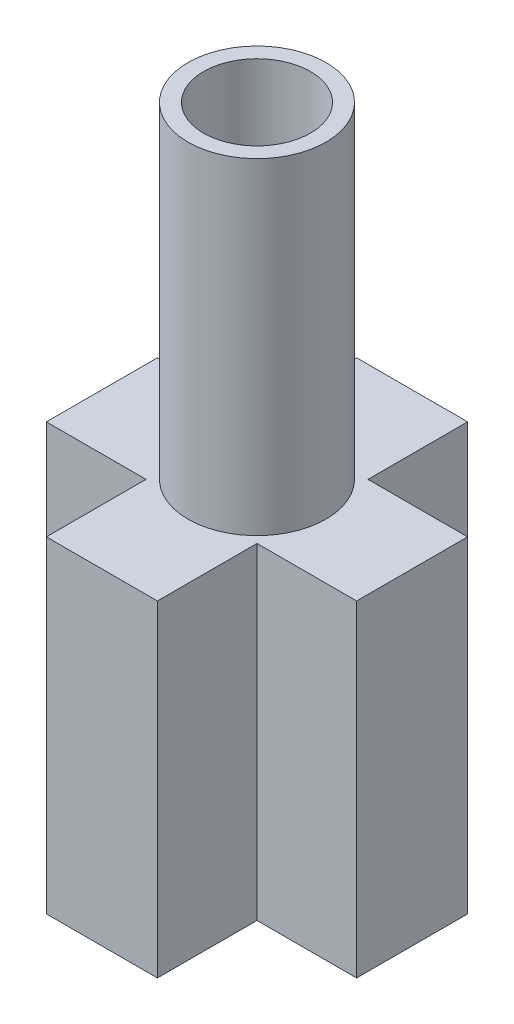
ISO-10303-21;
HEADER;
FILE_DESCRIPTION(('STEP AP214'),'2;1');
FILE_NAME('part.step','',(''),(''),'','','');
FILE_SCHEMA(('AUTOMOTIVE_DESIGN { 1 0 10303 214 1 1 1 1 }'));
ENDSEC;
DATA;
#1=APPLICATION_CONTEXT('core data for automotive mechanical design processes');
#2=APPLICATION_PROTOCOL_DEFINITION('international standard','automotive_design',2000,#1);
#3=PRODUCT_CONTEXT('',#1,'mechanical');
#4=PRODUCT('Part','Part','',(#3));
#5=PRODUCT_RELATED_PRODUCT_CATEGORY('part','',(#4));
#6=PRODUCT_DEFINITION_FORMATION('','',#4);
#7=PRODUCT_DEFINITION_CONTEXT('part definition',#1,'design');
#8=PRODUCT_DEFINITION('design','',#6,#7);
#9=PRODUCT_DEFINITION_SHAPE('','',#8);
#10=(LENGTH_UNIT() NAMED_UNIT(*) SI_UNIT(.MILLI.,.METRE.));
#11=(NAMED_UNIT(*) PLANE_ANGLE_UNIT() SI_UNIT($,.RADIAN.));
#12=(NAMED_UNIT(*) SI_UNIT($,.STERADIAN.) SOLID_ANGLE_UNIT());
#13=UNCERTAINTY_MEASURE_WITH_UNIT(LENGTH_MEASURE(1.E-05),#10,'distance_accuracy_value','');
#14=(GEOMETRIC_REPRESENTATION_CONTEXT(3) GLOBAL_UNCERTAINTY_ASSIGNED_CONTEXT((#13)) GLOBAL_UNIT_ASSIGNED_CONTEXT((#10,
#11,#12)) REPRESENTATION_CONTEXT('',''));
#15=CARTESIAN_POINT('',(0.,0.,0.));
#16=DIRECTION('',(0.,0.,1.));
#17=DIRECTION('',(1.,0.,0.));
#18=AXIS2_PLACEMENT_3D('',#15,#16,#17);
#19=CARTESIAN_POINT('',(0.863599999999994,5.08,0.863599999999999));
#20=DIRECTION('',(-1.,0.,0.));
#21=DIRECTION('',(0.,0.,1.));
#22=AXIS2_PLACEMENT_3D('',#19,#20,#21);
#23=PLANE('',#22);
#24=DIRECTION('',(0.,0.,-1.));
#25=VECTOR('',#24,1.);
#26=CARTESIAN_POINT('',(0.863599999999994,0.,0.863599999999999));
#27=LINE('',#26,#25);
#28=CARTESIAN_POINT('',(0.863599999999985,0.,2.41299999999999));
#29=VERTEX_POINT('',#28);
#30=CARTESIAN_POINT('',(0.863599999999994,0.,0.863599999999999));
#31=VERTEX_POINT('',#30);
#32=EDGE_CURVE('E161',#29,#31,#27,.T.);
#33=ORIENTED_EDGE('',*,*,#32,.T.);
#34=DIRECTION('',(0.,-1.,0.));
#35=VECTOR('',#34,1.);
#36=CARTESIAN_POINT('',(0.863599999999994,5.08,0.863599999999999));
#37=LINE('',#36,#35);
#38=CARTESIAN_POINT('',(0.863599999999994,5.08,0.863599999999999));
#39=VERTEX_POINT('',#38);
#40=EDGE_CURVE('E11',#39,#31,#37,.T.);
#41=ORIENTED_EDGE('',*,*,#40,.F.);
#42=DIRECTION('',(0.,0.,-1.));
#43=VECTOR('',#42,1.);
#44=CARTESIAN_POINT('',(0.863599999999994,5.08,0.863599999999999));
#45=LINE('',#44,#43);
#46=CARTESIAN_POINT('',(0.863599999999985,5.08,2.41299999999999));
#47=VERTEX_POINT('',#46);
#48=EDGE_CURVE('E184',#47,#39,#45,.T.);
#49=ORIENTED_EDGE('',*,*,#48,.F.);
#50=DIRECTION('',(0.,-1.,0.));
#51=VECTOR('',#50,1.);
#52=CARTESIAN_POINT('',(0.863599999999985,5.08,2.41299999999999));
#53=LINE('',#52,#51);
#54=EDGE_CURVE('E157',#47,#29,#53,.T.);
#55=ORIENTED_EDGE('',*,*,#54,.T.);
#56=EDGE_LOOP('',(#33,#41,#49,#55));
#57=FACE_BOUND('',#56,.T.);
#58=ADVANCED_FACE('F41',(#57),#23,.F.);
#59=CARTESIAN_POINT('',(0.863599999999994,5.08,0.863599999999999));
#60=DIRECTION('',(0.,0.,-1.));
#61=DIRECTION('',(-1.,0.,0.));
#62=AXIS2_PLACEMENT_3D('',#59,#60,#61);
#63=PLANE('',#62);
#64=DIRECTION('',(1.,0.,0.));
#65=VECTOR('',#64,1.);
#66=CARTESIAN_POINT('',(0.863599999999994,0.,0.863599999999999));
#67=LINE('',#66,#65);
#68=CARTESIAN_POINT('',(2.41299999999999,0.,0.863599999999998));
#69=VERTEX_POINT('',#68);
#70=EDGE_CURVE('E164',#31,#69,#67,.T.);
#71=ORIENTED_EDGE('',*,*,#70,.T.);
#72=DIRECTION('',(0.,-1.,0.));
#73=VECTOR('',#72,1.);
#74=CARTESIAN_POINT('',(2.41299999999999,5.08,0.863599999999998));
#75=LINE('',#74,#73);
#76=CARTESIAN_POINT('',(2.41299999999999,5.08,0.863599999999998));
#77=VERTEX_POINT('',#76);
#78=EDGE_CURVE('E49',#77,#69,#75,.T.);
#79=ORIENTED_EDGE('',*,*,#78,.F.);
#80=DIRECTION('',(1.,0.,0.));
#81=VECTOR('',#80,1.);
#82=CARTESIAN_POINT('',(0.863599999999994,5.08,0.863599999999999));
#83=LINE('',#82,#81);
#84=EDGE_CURVE('E112',#39,#77,#83,.T.);
#85=ORIENTED_EDGE('',*,*,#84,.F.);
#86=ORIENTED_EDGE('',*,*,#40,.T.);
#87=EDGE_LOOP('',(#71,#79,#85,#86));
#88=FACE_BOUND('',#87,.T.);
#89=ADVANCED_FACE('F263',(#88),#63,.F.);
#90=CARTESIAN_POINT('',(2.41299999999999,5.08,0.863599999999998));
#91=DIRECTION('',(-1.,0.,0.));
#92=DIRECTION('',(0.,0.,1.));
#93=AXIS2_PLACEMENT_3D('',#90,#91,#92);
#94=PLANE('',#93);
#95=DIRECTION('',(0.,0.,-1.));
#96=VECTOR('',#95,1.);
#97=CARTESIAN_POINT('',(2.41299999999999,0.,0.863599999999998));
#98=LINE('',#97,#96);
#99=CARTESIAN_POINT('',(2.41299999999999,0.,-0.863600000000002));
#100=VERTEX_POINT('',#99);
#101=EDGE_CURVE('E167',#69,#100,#98,.T.);
#102=ORIENTED_EDGE('',*,*,#101,.T.);
#103=DIRECTION('',(0.,-1.,0.));
#104=VECTOR('',#103,1.);
#105=CARTESIAN_POINT('',(2.41299999999999,5.08,-0.863600000000002));
#106=LINE('',#105,#104);
#107=CARTESIAN_POINT('',(2.41299999999999,5.08,-0.863600000000002));
#108=VERTEX_POINT('',#107);
#109=EDGE_CURVE('E203',#108,#100,#106,.T.);
#110=ORIENTED_EDGE('',*,*,#109,.F.);
#111=DIRECTION('',(0.,0.,-1.));
#112=VECTOR('',#111,1.);
#113=CARTESIAN_POINT('',(2.41299999999999,5.08,0.863599999999998));
#114=LINE('',#113,#112);
#115=EDGE_CURVE('E211',#77,#108,#114,.T.);
#116=ORIENTED_EDGE('',*,*,#115,.F.);
#117=ORIENTED_EDGE('',*,*,#78,.T.);
#118=EDGE_LOOP('',(#102,#110,#116,#117));
#119=FACE_BOUND('',#118,.T.);
#120=ADVANCED_FACE('F209',(#119),#94,.F.);
#121=CARTESIAN_POINT('',(0.863599999999994,5.08,-0.863600000000001));
#122=DIRECTION('',(0.,0.,1.));
#123=DIRECTION('',(1.,0.,0.));
#124=AXIS2_PLACEMENT_3D('',#121,#122,#123);
#125=PLANE('',#124);
#126=DIRECTION('',(-1.,0.,0.));
#127=VECTOR('',#126,1.);
#128=CARTESIAN_POINT('',(0.863599999999994,0.,-0.863600000000001));
#129=LINE('',#128,#127);
#130=CARTESIAN_POINT('',(0.863599999999994,0.,-0.863600000000001));
#131=VERTEX_POINT('',#130);
#132=EDGE_CURVE('E169',#100,#131,#129,.T.);
#133=ORIENTED_EDGE('',*,*,#132,.T.);
#134=DIRECTION('',(0.,-1.,0.));
#135=VECTOR('',#134,1.);
#136=CARTESIAN_POINT('',(0.863599999999994,5.08,-0.863600000000001));
#137=LINE('',#136,#135);
#138=CARTESIAN_POINT('',(0.863599999999994,5.08,-0.863600000000001));
#139=VERTEX_POINT('',#138);
#140=EDGE_CURVE('E200',#139,#131,#137,.T.);
#141=ORIENTED_EDGE('',*,*,#140,.F.);
#142=DIRECTION('',(-1.,0.,0.));
#143=VECTOR('',#142,1.);
#144=CARTESIAN_POINT('',(0.863599999999994,5.08,-0.863600000000001));
#145=LINE('',#144,#143);
#146=EDGE_CURVE('E229',#108,#139,#145,.T.);
#147=ORIENTED_EDGE('',*,*,#146,.F.);
#148=ORIENTED_EDGE('',*,*,#109,.T.);
#149=EDGE_LOOP('',(#133,#141,#147,#148));
#150=FACE_BOUND('',#149,.T.);
#151=ADVANCED_FACE('F220',(#150),#125,.F.);
#152=CARTESIAN_POINT('',(0.863599999999985,5.08,-2.413));
#153=DIRECTION('',(-1.,0.,0.));
#154=DIRECTION('',(0.,0.,1.));
#155=AXIS2_PLACEMENT_3D('',#152,#153,#154);
#156=PLANE('',#155);
#157=DIRECTION('',(0.,0.,-1.));
#158=VECTOR('',#157,1.);
#159=CARTESIAN_POINT('',(0.863599999999985,0.,-2.413));
#160=LINE('',#159,#158);
#161=CARTESIAN_POINT('',(0.863599999999985,0.,-2.413));
#162=VERTEX_POINT('',#161);
#163=EDGE_CURVE('E171',#131,#162,#160,.T.);
#164=ORIENTED_EDGE('',*,*,#163,.T.);
#165=DIRECTION('',(0.,-1.,0.));
#166=VECTOR('',#165,1.);
#167=CARTESIAN_POINT('',(0.863599999999985,5.08,-2.413));
#168=LINE('',#167,#166);
#169=CARTESIAN_POINT('',(0.863599999999985,5.08,-2.413));
#170=VERTEX_POINT('',#169);
#171=EDGE_CURVE('E197',#170,#162,#168,.T.);
#172=ORIENTED_EDGE('',*,*,#171,.F.);
#173=DIRECTION('',(0.,0.,-1.));
#174=VECTOR('',#173,1.);
#175=CARTESIAN_POINT('',(0.863599999999985,5.08,-2.413));
#176=LINE('',#175,#174);
#177=EDGE_CURVE('E226',#139,#170,#176,.T.);
#178=ORIENTED_EDGE('',*,*,#177,.F.);
#179=ORIENTED_EDGE('',*,*,#140,.T.);
#180=EDGE_LOOP('',(#164,#172,#178,#179));
#181=FACE_BOUND('',#180,.T.);
#182=ADVANCED_FACE('F224',(#181),#156,.F.);
#183=CARTESIAN_POINT('',(-0.863600000000019,5.08,-2.413));
#184=DIRECTION('',(0.,0.,1.));
#185=DIRECTION('',(1.,0.,0.));
#186=AXIS2_PLACEMENT_3D('',#183,#184,#185);
#187=PLANE('',#186);
#188=DIRECTION('',(-1.,0.,0.));
#189=VECTOR('',#188,1.);
#190=CARTESIAN_POINT('',(-0.863600000000019,0.,-2.413));
#191=LINE('',#190,#189);
#192=CARTESIAN_POINT('',(-0.863600000000019,0.,-2.413));
#193=VERTEX_POINT('',#192);
#194=EDGE_CURVE('E173',#162,#193,#191,.T.);
#195=ORIENTED_EDGE('',*,*,#194,.T.);
#196=DIRECTION('',(0.,-1.,0.));
#197=VECTOR('',#196,1.);
#198=CARTESIAN_POINT('',(-0.863600000000019,5.08,-2.413));
#199=LINE('',#198,#197);
#200=CARTESIAN_POINT('',(-0.863600000000019,5.08,-2.413));
#201=VERTEX_POINT('',#200);
#202=EDGE_CURVE('E194',#201,#193,#199,.T.);
#203=ORIENTED_EDGE('',*,*,#202,.F.);
#204=DIRECTION('',(-1.,0.,0.));
#205=VECTOR('',#204,1.);
#206=CARTESIAN_POINT('',(-0.863600000000019,5.08,-2.413));
#207=LINE('',#206,#205);
#208=EDGE_CURVE('E228',#170,#201,#207,.T.);
#209=ORIENTED_EDGE('',*,*,#208,.F.);
#210=ORIENTED_EDGE('',*,*,#171,.T.);
#211=EDGE_LOOP('',(#195,#203,#209,#210));
#212=FACE_BOUND('',#211,.T.);
#213=ADVANCED_FACE('F276',(#212),#187,.F.);
#214=CARTESIAN_POINT('',(-0.863600000000019,5.08,-2.413));
#215=DIRECTION('',(1.,0.,0.));
#216=DIRECTION('',(0.,0.,-1.));
#217=AXIS2_PLACEMENT_3D('',#214,#215,#216);
#218=PLANE('',#217);
#219=DIRECTION('',(0.,0.,1.));
#220=VECTOR('',#219,1.);
#221=CARTESIAN_POINT('',(-0.863600000000019,0.,-2.413));
#222=LINE('',#221,#220);
#223=CARTESIAN_POINT('',(-0.863600000000004,0.,-0.8636));
#224=VERTEX_POINT('',#223);
#225=EDGE_CURVE('E175',#193,#224,#222,.T.);
#226=ORIENTED_EDGE('',*,*,#225,.T.);
#227=DIRECTION('',(0.,-1.,0.));
#228=VECTOR('',#227,1.);
#229=CARTESIAN_POINT('',(-0.863600000000004,5.08,-0.8636));
#230=LINE('',#229,#228);
#231=CARTESIAN_POINT('',(-0.863600000000004,5.08,-0.8636));
#232=VERTEX_POINT('',#231);
#233=EDGE_CURVE('E191',#232,#224,#230,.T.);
#234=ORIENTED_EDGE('',*,*,#233,.F.);
#235=DIRECTION('',(0.,0.,1.));
#236=VECTOR('',#235,1.);
#237=CARTESIAN_POINT('',(-0.863600000000019,5.08,-2.413));
#238=LINE('',#237,#236);
#239=EDGE_CURVE('E231',#201,#232,#238,.T.);
#240=ORIENTED_EDGE('',*,*,#239,.F.);
#241=ORIENTED_EDGE('',*,*,#202,.T.);
#242=EDGE_LOOP('',(#226,#234,#240,#241));
#243=FACE_BOUND('',#242,.T.);
#244=ADVANCED_FACE('F279',(#243),#218,.F.);
#245=CARTESIAN_POINT('',(-2.41300000000001,5.08,-0.863600000000002));
#246=DIRECTION('',(0.,0.,1.));
#247=DIRECTION('',(1.,0.,0.));
#248=AXIS2_PLACEMENT_3D('',#245,#246,#247);
#249=PLANE('',#248);
#250=DIRECTION('',(-1.,0.,0.));
#251=VECTOR('',#250,1.);
#252=CARTESIAN_POINT('',(-2.41300000000001,0.,-0.863600000000002));
#253=LINE('',#252,#251);
#254=CARTESIAN_POINT('',(-2.41300000000001,0.,-0.863600000000002));
#255=VERTEX_POINT('',#254);
#256=EDGE_CURVE('E177',#224,#255,#253,.T.);
#257=ORIENTED_EDGE('',*,*,#256,.T.);
#258=DIRECTION('',(0.,-1.,0.));
#259=VECTOR('',#258,1.);
#260=CARTESIAN_POINT('',(-2.41300000000001,5.08,-0.863600000000002));
#261=LINE('',#260,#259);
#262=CARTESIAN_POINT('',(-2.41300000000001,5.08,-0.863600000000002));
#263=VERTEX_POINT('',#262);
#264=EDGE_CURVE('E188',#263,#255,#261,.T.);
#265=ORIENTED_EDGE('',*,*,#264,.F.);
#266=DIRECTION('',(-1.,0.,0.));
#267=VECTOR('',#266,1.);
#268=CARTESIAN_POINT('',(-2.41300000000001,5.08,-0.863600000000002));
#269=LINE('',#268,#267);
#270=EDGE_CURVE('E237',#232,#263,#269,.T.);
#271=ORIENTED_EDGE('',*,*,#270,.F.);
#272=ORIENTED_EDGE('',*,*,#233,.T.);
#273=EDGE_LOOP('',(#257,#265,#271,#272));
#274=FACE_BOUND('',#273,.T.);
#275=ADVANCED_FACE('F243',(#274),#249,.F.);
#276=CARTESIAN_POINT('',(-2.41300000000001,5.08,0.863599999999998));
#277=DIRECTION('',(1.,0.,0.));
#278=DIRECTION('',(0.,0.,-1.));
#279=AXIS2_PLACEMENT_3D('',#276,#277,#278);
#280=PLANE('',#279);
#281=DIRECTION('',(0.,0.,1.));
#282=VECTOR('',#281,1.);
#283=CARTESIAN_POINT('',(-2.41300000000001,0.,0.863599999999998));
#284=LINE('',#283,#282);
#285=CARTESIAN_POINT('',(-2.41300000000001,0.,0.863599999999998));
#286=VERTEX_POINT('',#285);
#287=EDGE_CURVE('E179',#255,#286,#284,.T.);
#288=ORIENTED_EDGE('',*,*,#287,.T.);
#289=DIRECTION('',(0.,-1.,0.));
#290=VECTOR('',#289,1.);
#291=CARTESIAN_POINT('',(-2.41300000000001,5.08,0.863599999999998));
#292=LINE('',#291,#290);
#293=CARTESIAN_POINT('',(-2.41300000000001,5.08,0.863599999999998));
#294=VERTEX_POINT('',#293);
#295=EDGE_CURVE('E152',#294,#286,#292,.T.);
#296=ORIENTED_EDGE('',*,*,#295,.F.);
#297=DIRECTION('',(0.,0.,1.));
#298=VECTOR('',#297,1.);
#299=CARTESIAN_POINT('',(-2.41300000000001,5.08,0.863599999999998));
#300=LINE('',#299,#298);
#301=EDGE_CURVE('E143',#263,#294,#300,.T.);
#302=ORIENTED_EDGE('',*,*,#301,.F.);
#303=ORIENTED_EDGE('',*,*,#264,.T.);
#304=EDGE_LOOP('',(#288,#296,#302,#303));
#305=FACE_BOUND('',#304,.T.);
#306=ADVANCED_FACE('F247',(#305),#280,.F.);
#307=CARTESIAN_POINT('',(-2.41300000000001,5.08,0.863599999999998));
#308=DIRECTION('',(0.,0.,-1.));
#309=DIRECTION('',(-1.,0.,0.));
#310=AXIS2_PLACEMENT_3D('',#307,#308,#309);
#311=PLANE('',#310);
#312=DIRECTION('',(1.,0.,0.));
#313=VECTOR('',#312,1.);
#314=CARTESIAN_POINT('',(-2.41300000000001,0.,0.863599999999998));
#315=LINE('',#314,#313);
#316=CARTESIAN_POINT('',(-0.863600000000004,0.,0.8636));
#317=VERTEX_POINT('',#316);
#318=EDGE_CURVE('E151',#286,#317,#315,.T.);
#319=ORIENTED_EDGE('',*,*,#318,.T.);
#320=DIRECTION('',(0.,-1.,0.));
#321=VECTOR('',#320,1.);
#322=CARTESIAN_POINT('',(-0.863600000000004,5.08,0.8636));
#323=LINE('',#322,#321);
#324=CARTESIAN_POINT('',(-0.863600000000004,5.08,0.8636));
#325=VERTEX_POINT('',#324);
#326=EDGE_CURVE('E148',#325,#317,#323,.T.);
#327=ORIENTED_EDGE('',*,*,#326,.F.);
#328=DIRECTION('',(1.,0.,0.));
#329=VECTOR('',#328,1.);
#330=CARTESIAN_POINT('',(-2.41300000000001,5.08,0.863599999999998));
#331=LINE('',#330,#329);
#332=EDGE_CURVE('E137',#294,#325,#331,.T.);
#333=ORIENTED_EDGE('',*,*,#332,.F.);
#334=ORIENTED_EDGE('',*,*,#295,.T.);
#335=EDGE_LOOP('',(#319,#327,#333,#334));
#336=FACE_BOUND('',#335,.T.);
#337=ADVANCED_FACE('F149',(#336),#311,.F.);
#338=CARTESIAN_POINT('',(-0.863600000000004,5.08,0.8636));
#339=DIRECTION('',(1.,0.,0.));
#340=DIRECTION('',(0.,0.,-1.));
#341=AXIS2_PLACEMENT_3D('',#338,#339,#340);
#342=PLANE('',#341);
#343=DIRECTION('',(0.,0.,1.));
#344=VECTOR('',#343,1.);
#345=CARTESIAN_POINT('',(-0.863600000000004,0.,0.8636));
#346=LINE('',#345,#344);
#347=CARTESIAN_POINT('',(-0.863600000000019,0.,2.41299999999999));
#348=VERTEX_POINT('',#347);
#349=EDGE_CURVE('E98',#317,#348,#346,.T.);
#350=ORIENTED_EDGE('',*,*,#349,.T.);
#351=DIRECTION('',(0.,-1.,0.));
#352=VECTOR('',#351,1.);
#353=CARTESIAN_POINT('',(-0.863600000000019,5.08,2.41299999999999));
#354=LINE('',#353,#352);
#355=CARTESIAN_POINT('',(-0.863600000000019,5.08,2.41299999999999));
#356=VERTEX_POINT('',#355);
#357=EDGE_CURVE('E153',#356,#348,#354,.T.);
#358=ORIENTED_EDGE('',*,*,#357,.F.);
#359=DIRECTION('',(0.,0.,1.));
#360=VECTOR('',#359,1.);
#361=CARTESIAN_POINT('',(-0.863600000000004,5.08,0.8636));
#362=LINE('',#361,#360);
#363=EDGE_CURVE('E141',#325,#356,#362,.T.);
#364=ORIENTED_EDGE('',*,*,#363,.F.);
#365=ORIENTED_EDGE('',*,*,#326,.T.);
#366=EDGE_LOOP('',(#350,#358,#364,#365));
#367=FACE_BOUND('',#366,.T.);
#368=ADVANCED_FACE('F155',(#367),#342,.F.);
#369=CARTESIAN_POINT('',(-0.863600000000019,5.08,2.41299999999999));
#370=DIRECTION('',(0.,0.,-1.));
#371=DIRECTION('',(-1.,0.,0.));
#372=AXIS2_PLACEMENT_3D('',#369,#370,#371);
#373=PLANE('',#372);
#374=DIRECTION('',(1.,0.,0.));
#375=VECTOR('',#374,1.);
#376=CARTESIAN_POINT('',(-0.863600000000019,0.,2.41299999999999));
#377=LINE('',#376,#375);
#378=EDGE_CURVE('E104',#348,#29,#377,.T.);
#379=ORIENTED_EDGE('',*,*,#378,.T.);
#380=ORIENTED_EDGE('',*,*,#54,.F.);
#381=DIRECTION('',(1.,0.,0.));
#382=VECTOR('',#381,1.);
#383=CARTESIAN_POINT('',(-0.863600000000019,5.08,2.41299999999999));
#384=LINE('',#383,#382);
#385=EDGE_CURVE('E57',#356,#47,#384,.T.);
#386=ORIENTED_EDGE('',*,*,#385,.F.);
#387=ORIENTED_EDGE('',*,*,#357,.T.);
#388=EDGE_LOOP('',(#379,#380,#386,#387));
#389=FACE_BOUND('',#388,.T.);
#390=ADVANCED_FACE('F251',(#389),#373,.F.);
#391=CARTESIAN_POINT('',(0.,5.08,0.));
#392=DIRECTION('',(0.,1.,0.));
#393=DIRECTION('',(0.,0.,1.));
#394=AXIS2_PLACEMENT_3D('',#391,#392,#393);
#395=PLANE('',#394);
#396=CARTESIAN_POINT('',(0.,5.08,0.));
#397=DIRECTION('',(0.,1.,0.));
#398=DIRECTION('',(0.,0.,1.));
#399=AXIS2_PLACEMENT_3D('',#396,#397,#398);
#400=CIRCLE('',#399,1.07330358317309);
#401=CARTESIAN_POINT('',(0.,5.08,1.07330358317309));
#402=VERTEX_POINT('',#401);
#403=EDGE_CURVE('E366',#402,#402,#400,.T.);
#404=ORIENTED_EDGE('',*,*,#403,.F.);
#405=EDGE_LOOP('',(#404));
#406=FACE_BOUND('',#405,.T.);
#407=ORIENTED_EDGE('',*,*,#48,.T.);
#408=ORIENTED_EDGE('',*,*,#84,.T.);
#409=ORIENTED_EDGE('',*,*,#115,.T.);
#410=ORIENTED_EDGE('',*,*,#146,.T.);
#411=ORIENTED_EDGE('',*,*,#177,.T.);
#412=ORIENTED_EDGE('',*,*,#208,.T.);
#413=ORIENTED_EDGE('',*,*,#239,.T.);
#414=ORIENTED_EDGE('',*,*,#270,.T.);
#415=ORIENTED_EDGE('',*,*,#301,.T.);
#416=ORIENTED_EDGE('',*,*,#332,.T.);
#417=ORIENTED_EDGE('',*,*,#363,.T.);
#418=ORIENTED_EDGE('',*,*,#385,.T.);
#419=EDGE_LOOP('',(#407,#408,#409,#410,#411,#412,#413,#414,#415,#416,#417,#418));
#420=FACE_BOUND('',#419,.T.);
#421=ADVANCED_FACE('F139',(#406,#420),#395,.T.);
#422=CARTESIAN_POINT('',(0.,0.,0.));
#423=DIRECTION('',(0.,1.,0.));
#424=DIRECTION('',(0.,0.,1.));
#425=AXIS2_PLACEMENT_3D('',#422,#423,#424);
#426=PLANE('',#425);
#427=ORIENTED_EDGE('',*,*,#32,.F.);
#428=ORIENTED_EDGE('',*,*,#378,.F.);
#429=ORIENTED_EDGE('',*,*,#349,.F.);
#430=ORIENTED_EDGE('',*,*,#318,.F.);
#431=ORIENTED_EDGE('',*,*,#287,.F.);
#432=ORIENTED_EDGE('',*,*,#256,.F.);
#433=ORIENTED_EDGE('',*,*,#225,.F.);
#434=ORIENTED_EDGE('',*,*,#194,.F.);
#435=ORIENTED_EDGE('',*,*,#163,.F.);
#436=ORIENTED_EDGE('',*,*,#132,.F.);
#437=ORIENTED_EDGE('',*,*,#101,.F.);
#438=ORIENTED_EDGE('',*,*,#70,.F.);
#439=EDGE_LOOP('',(#427,#428,#429,#430,#431,#432,#433,#434,#435,#436,#437,#438));
#440=FACE_BOUND('',#439,.T.);
#441=ADVANCED_FACE('F215',(#440),#426,.F.);
#442=CARTESIAN_POINT('',(0.,10.16,0.));
#443=DIRECTION('',(0.,1.,0.));
#444=DIRECTION('',(0.,0.,1.));
#445=AXIS2_PLACEMENT_3D('',#442,#443,#444);
#446=PLANE('',#445);
#447=CARTESIAN_POINT('',(0.,10.16,0.));
#448=DIRECTION('',(0.,1.,0.));
#449=DIRECTION('',(0.,0.,1.));
#450=AXIS2_PLACEMENT_3D('',#447,#448,#449);
#451=CIRCLE('',#450,1.07330358317309);
#452=CARTESIAN_POINT('',(0.,10.16,1.07330358317309));
#453=VERTEX_POINT('',#452);
#454=EDGE_CURVE('E165',#453,#453,#451,.T.);
#455=ORIENTED_EDGE('',*,*,#454,.T.);
#456=EDGE_LOOP('',(#455));
#457=FACE_BOUND('',#456,.T.);
#458=CARTESIAN_POINT('',(0.,10.16,0.));
#459=DIRECTION('',(0.,1.,0.));
#460=DIRECTION('',(0.,0.,1.));
#461=AXIS2_PLACEMENT_3D('',#458,#459,#460);
#462=CIRCLE('',#461,0.831378849362567);
#463=CARTESIAN_POINT('',(0.,10.16,0.831378849362567));
#464=VERTEX_POINT('',#463);
#465=EDGE_CURVE('E363',#464,#464,#462,.T.);
#466=ORIENTED_EDGE('',*,*,#465,.F.);
#467=EDGE_LOOP('',(#466));
#468=FACE_BOUND('',#467,.T.);
#469=ADVANCED_FACE('F311',(#457,#468),#446,.T.);
#470=CARTESIAN_POINT('',(0.,10.16,0.));
#471=DIRECTION('',(0.,-1.,0.));
#472=DIRECTION('',(0.,0.,-1.));
#473=AXIS2_PLACEMENT_3D('',#470,#471,#472);
#474=CYLINDRICAL_SURFACE('',#473,1.07330358317309);
#475=ORIENTED_EDGE('',*,*,#454,.F.);
#476=EDGE_LOOP('',(#475));
#477=FACE_BOUND('',#476,.T.);
#478=ORIENTED_EDGE('',*,*,#403,.T.);
#479=EDGE_LOOP('',(#478));
#480=FACE_BOUND('',#479,.T.);
#481=ADVANCED_FACE('F324',(#477,#480),#474,.T.);
#482=CARTESIAN_POINT('',(0.,10.16,0.));
#483=DIRECTION('',(0.,-1.,0.));
#484=DIRECTION('',(0.,0.,-1.));
#485=AXIS2_PLACEMENT_3D('',#482,#483,#484);
#486=CYLINDRICAL_SURFACE('',#485,0.831378849362567);
#487=ORIENTED_EDGE('',*,*,#465,.T.);
#488=EDGE_LOOP('',(#487));
#489=FACE_BOUND('',#488,.T.);
#490=CARTESIAN_POINT('',(0.,1.27,0.));
#491=DIRECTION('',(0.,1.,0.));
#492=DIRECTION('',(0.,0.,1.));
#493=AXIS2_PLACEMENT_3D('',#490,#491,#492);
#494=CIRCLE('',#493,0.831378849362567);
#495=CARTESIAN_POINT('',(0.,1.27,0.831378849362567));
#496=VERTEX_POINT('',#495);
#497=EDGE_CURVE('E361',#496,#496,#494,.T.);
#498=ORIENTED_EDGE('',*,*,#497,.F.);
#499=EDGE_LOOP('',(#498));
#500=FACE_BOUND('',#499,.T.);
#501=ADVANCED_FACE('F334',(#489,#500),#486,.F.);
#502=CARTESIAN_POINT('',(0.,1.27,0.));
#503=DIRECTION('',(0.,1.,0.));
#504=DIRECTION('',(0.,0.,1.));
#505=AXIS2_PLACEMENT_3D('',#502,#503,#504);
#506=PLANE('',#505);
#507=ORIENTED_EDGE('',*,*,#497,.T.);
#508=EDGE_LOOP('',(#507));
#509=FACE_BOUND('',#508,.T.);
#510=ADVANCED_FACE('F345',(#509),#506,.T.);
#511=CLOSED_SHELL('',(#58,#89,#120,#151,#182,#213,#244,#275,#306,#337,#368,#390,#421,#441,#469,
#481,#501,#510));
#512=MANIFOLD_SOLID_BREP('B2',#511);
#513=ADVANCED_BREP_SHAPE_REPRESENTATION('',(#18,#512),#14);
#514=SHAPE_DEFINITION_REPRESENTATION(#9,#513);
ENDSEC;
END-ISO-10303-21;
